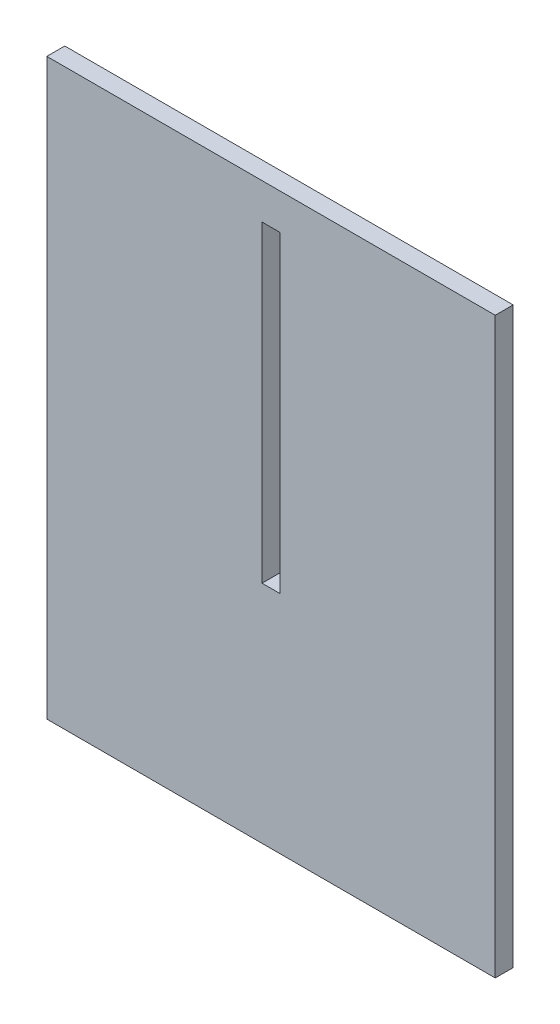
ISO-10303-21;
HEADER;
FILE_DESCRIPTION(('STEP AP214'),'2;1');
FILE_NAME('part.step','',(''),(''),'','','');
FILE_SCHEMA(('AUTOMOTIVE_DESIGN { 1 0 10303 214 1 1 1 1 }'));
ENDSEC;
DATA;
#1=APPLICATION_CONTEXT('core data for automotive mechanical design processes');
#2=APPLICATION_PROTOCOL_DEFINITION('international standard','automotive_design',2000,#1);
#3=PRODUCT_CONTEXT('',#1,'mechanical');
#4=PRODUCT('Part','Part','',(#3));
#5=PRODUCT_RELATED_PRODUCT_CATEGORY('part','',(#4));
#6=PRODUCT_DEFINITION_FORMATION('','',#4);
#7=PRODUCT_DEFINITION_CONTEXT('part definition',#1,'design');
#8=PRODUCT_DEFINITION('design','',#6,#7);
#9=PRODUCT_DEFINITION_SHAPE('','',#8);
#10=(LENGTH_UNIT() NAMED_UNIT(*) SI_UNIT(.MILLI.,.METRE.));
#11=(NAMED_UNIT(*) PLANE_ANGLE_UNIT() SI_UNIT($,.RADIAN.));
#12=(NAMED_UNIT(*) SI_UNIT($,.STERADIAN.) SOLID_ANGLE_UNIT());
#13=UNCERTAINTY_MEASURE_WITH_UNIT(LENGTH_MEASURE(1.E-05),#10,'distance_accuracy_value','');
#14=(GEOMETRIC_REPRESENTATION_CONTEXT(3) GLOBAL_UNCERTAINTY_ASSIGNED_CONTEXT((#13)) GLOBAL_UNIT_ASSIGNED_CONTEXT((#10,
#11,#12)) REPRESENTATION_CONTEXT('',''));
#15=CARTESIAN_POINT('',(0.,0.,0.));
#16=DIRECTION('',(0.,0.,1.));
#17=DIRECTION('',(1.,0.,0.));
#18=AXIS2_PLACEMENT_3D('',#15,#16,#17);
#19=CARTESIAN_POINT('',(0.,0.,5.));
#20=DIRECTION('',(0.,0.,1.));
#21=DIRECTION('',(1.,0.,0.));
#22=AXIS2_PLACEMENT_3D('',#19,#20,#21);
#23=PLANE('',#22);
#24=DIRECTION('',(0.,-1.,0.));
#25=VECTOR('',#24,1.);
#26=CARTESIAN_POINT('',(0.,0.,5.));
#27=LINE('',#26,#25);
#28=CARTESIAN_POINT('',(0.,0.,5.));
#29=VERTEX_POINT('',#28);
#30=CARTESIAN_POINT('',(0.,-160.,5.));
#31=VERTEX_POINT('',#30);
#32=EDGE_CURVE('E153',#29,#31,#27,.T.);
#33=ORIENTED_EDGE('',*,*,#32,.T.);
#34=DIRECTION('',(1.,0.,0.));
#35=VECTOR('',#34,1.);
#36=CARTESIAN_POINT('',(0.,-160.,5.));
#37=LINE('',#36,#35);
#38=CARTESIAN_POINT('',(125.,-160.,5.));
#39=VERTEX_POINT('',#38);
#40=EDGE_CURVE('E157',#31,#39,#37,.T.);
#41=ORIENTED_EDGE('',*,*,#40,.T.);
#42=DIRECTION('',(0.,1.,0.));
#43=VECTOR('',#42,1.);
#44=CARTESIAN_POINT('',(125.,0.,5.));
#45=LINE('',#44,#43);
#46=CARTESIAN_POINT('',(125.,0.,5.));
#47=VERTEX_POINT('',#46);
#48=EDGE_CURVE('E161',#39,#47,#45,.T.);
#49=ORIENTED_EDGE('',*,*,#48,.T.);
#50=DIRECTION('',(-1.,0.,0.));
#51=VECTOR('',#50,1.);
#52=CARTESIAN_POINT('',(0.,0.,5.));
#53=LINE('',#52,#51);
#54=EDGE_CURVE('E164',#47,#29,#53,.T.);
#55=ORIENTED_EDGE('',*,*,#54,.T.);
#56=EDGE_LOOP('',(#33,#41,#49,#55));
#57=FACE_BOUND('',#56,.T.);
#58=DIRECTION('',(1.,0.,0.));
#59=VECTOR('',#58,1.);
#60=CARTESIAN_POINT('',(60.,-97.1892253638949,5.));
#61=LINE('',#60,#59);
#62=CARTESIAN_POINT('',(60.,-97.1892253638949,5.));
#63=VERTEX_POINT('',#62);
#64=CARTESIAN_POINT('',(65.,-97.1892253638949,5.));
#65=VERTEX_POINT('',#64);
#66=EDGE_CURVE('E114',#63,#65,#61,.T.);
#67=ORIENTED_EDGE('',*,*,#66,.F.);
#68=DIRECTION('',(0.,-1.,0.));
#69=VECTOR('',#68,1.);
#70=CARTESIAN_POINT('',(60.,-10.,5.));
#71=LINE('',#70,#69);
#72=CARTESIAN_POINT('',(60.,-10.,5.));
#73=VERTEX_POINT('',#72);
#74=EDGE_CURVE('E105',#73,#63,#71,.T.);
#75=ORIENTED_EDGE('',*,*,#74,.F.);
#76=DIRECTION('',(-1.,0.,0.));
#77=VECTOR('',#76,1.);
#78=CARTESIAN_POINT('',(60.,-10.,5.));
#79=LINE('',#78,#77);
#80=CARTESIAN_POINT('',(65.,-10.,5.));
#81=VERTEX_POINT('',#80);
#82=EDGE_CURVE('E131',#81,#73,#79,.T.);
#83=ORIENTED_EDGE('',*,*,#82,.F.);
#84=DIRECTION('',(0.,1.,0.));
#85=VECTOR('',#84,1.);
#86=CARTESIAN_POINT('',(65.,-10.,5.));
#87=LINE('',#86,#85);
#88=EDGE_CURVE('E127',#65,#81,#87,.T.);
#89=ORIENTED_EDGE('',*,*,#88,.F.);
#90=EDGE_LOOP('',(#67,#75,#83,#89));
#91=FACE_BOUND('',#90,.T.);
#92=ADVANCED_FACE('F39',(#57,#91),#23,.T.);
#93=CARTESIAN_POINT('',(0.,0.,0.));
#94=DIRECTION('',(0.,0.,1.));
#95=DIRECTION('',(1.,0.,0.));
#96=AXIS2_PLACEMENT_3D('',#93,#94,#95);
#97=PLANE('',#96);
#98=DIRECTION('',(0.,-1.,0.));
#99=VECTOR('',#98,1.);
#100=CARTESIAN_POINT('',(0.,0.,0.));
#101=LINE('',#100,#99);
#102=CARTESIAN_POINT('',(0.,0.,0.));
#103=VERTEX_POINT('',#102);
#104=CARTESIAN_POINT('',(0.,-160.,0.));
#105=VERTEX_POINT('',#104);
#106=EDGE_CURVE('E123',#103,#105,#101,.T.);
#107=ORIENTED_EDGE('',*,*,#106,.F.);
#108=DIRECTION('',(-1.,0.,0.));
#109=VECTOR('',#108,1.);
#110=CARTESIAN_POINT('',(0.,0.,0.));
#111=LINE('',#110,#109);
#112=CARTESIAN_POINT('',(125.,0.,0.));
#113=VERTEX_POINT('',#112);
#114=EDGE_CURVE('E158',#113,#103,#111,.T.);
#115=ORIENTED_EDGE('',*,*,#114,.F.);
#116=DIRECTION('',(0.,1.,0.));
#117=VECTOR('',#116,1.);
#118=CARTESIAN_POINT('',(125.,0.,0.));
#119=LINE('',#118,#117);
#120=CARTESIAN_POINT('',(125.,-160.,0.));
#121=VERTEX_POINT('',#120);
#122=EDGE_CURVE('E174',#121,#113,#119,.T.);
#123=ORIENTED_EDGE('',*,*,#122,.F.);
#124=DIRECTION('',(1.,0.,0.));
#125=VECTOR('',#124,1.);
#126=CARTESIAN_POINT('',(0.,-160.,0.));
#127=LINE('',#126,#125);
#128=EDGE_CURVE('E171',#105,#121,#127,.T.);
#129=ORIENTED_EDGE('',*,*,#128,.F.);
#130=EDGE_LOOP('',(#107,#115,#123,#129));
#131=FACE_BOUND('',#130,.T.);
#132=DIRECTION('',(0.,-1.,0.));
#133=VECTOR('',#132,1.);
#134=CARTESIAN_POINT('',(60.,-10.,0.));
#135=LINE('',#134,#133);
#136=CARTESIAN_POINT('',(60.,-10.,0.));
#137=VERTEX_POINT('',#136);
#138=CARTESIAN_POINT('',(60.,-97.1892253638949,0.));
#139=VERTEX_POINT('',#138);
#140=EDGE_CURVE('E63',#137,#139,#135,.T.);
#141=ORIENTED_EDGE('',*,*,#140,.T.);
#142=DIRECTION('',(1.,0.,0.));
#143=VECTOR('',#142,1.);
#144=CARTESIAN_POINT('',(60.,-97.1892253638949,0.));
#145=LINE('',#144,#143);
#146=CARTESIAN_POINT('',(65.,-97.1892253638949,0.));
#147=VERTEX_POINT('',#146);
#148=EDGE_CURVE('E121',#139,#147,#145,.T.);
#149=ORIENTED_EDGE('',*,*,#148,.T.);
#150=DIRECTION('',(0.,1.,0.));
#151=VECTOR('',#150,1.);
#152=CARTESIAN_POINT('',(65.,-10.,0.));
#153=LINE('',#152,#151);
#154=CARTESIAN_POINT('',(65.,-10.,0.));
#155=VERTEX_POINT('',#154);
#156=EDGE_CURVE('E140',#147,#155,#153,.T.);
#157=ORIENTED_EDGE('',*,*,#156,.T.);
#158=DIRECTION('',(-1.,0.,0.));
#159=VECTOR('',#158,1.);
#160=CARTESIAN_POINT('',(60.,-10.,0.));
#161=LINE('',#160,#159);
#162=EDGE_CURVE('E115',#155,#137,#161,.T.);
#163=ORIENTED_EDGE('',*,*,#162,.T.);
#164=EDGE_LOOP('',(#141,#149,#157,#163));
#165=FACE_BOUND('',#164,.T.);
#166=ADVANCED_FACE('F197',(#131,#165),#97,.F.);
#167=CARTESIAN_POINT('',(0.,0.,5.));
#168=DIRECTION('',(1.,0.,0.));
#169=DIRECTION('',(0.,1.,0.));
#170=AXIS2_PLACEMENT_3D('',#167,#168,#169);
#171=PLANE('',#170);
#172=ORIENTED_EDGE('',*,*,#106,.T.);
#173=DIRECTION('',(0.,0.,-1.));
#174=VECTOR('',#173,1.);
#175=CARTESIAN_POINT('',(0.,-160.,5.));
#176=LINE('',#175,#174);
#177=EDGE_CURVE('E11',#31,#105,#176,.T.);
#178=ORIENTED_EDGE('',*,*,#177,.F.);
#179=ORIENTED_EDGE('',*,*,#32,.F.);
#180=DIRECTION('',(0.,0.,-1.));
#181=VECTOR('',#180,1.);
#182=CARTESIAN_POINT('',(0.,0.,5.));
#183=LINE('',#182,#181);
#184=EDGE_CURVE('E167',#29,#103,#183,.T.);
#185=ORIENTED_EDGE('',*,*,#184,.T.);
#186=EDGE_LOOP('',(#172,#178,#179,#185));
#187=FACE_BOUND('',#186,.T.);
#188=ADVANCED_FACE('F41',(#187),#171,.F.);
#189=CARTESIAN_POINT('',(0.,-160.,5.));
#190=DIRECTION('',(0.,1.,0.));
#191=DIRECTION('',(0.,0.,1.));
#192=AXIS2_PLACEMENT_3D('',#189,#190,#191);
#193=PLANE('',#192);
#194=ORIENTED_EDGE('',*,*,#128,.T.);
#195=DIRECTION('',(0.,0.,-1.));
#196=VECTOR('',#195,1.);
#197=CARTESIAN_POINT('',(125.,-160.,5.));
#198=LINE('',#197,#196);
#199=EDGE_CURVE('E48',#39,#121,#198,.T.);
#200=ORIENTED_EDGE('',*,*,#199,.F.);
#201=ORIENTED_EDGE('',*,*,#40,.F.);
#202=ORIENTED_EDGE('',*,*,#177,.T.);
#203=EDGE_LOOP('',(#194,#200,#201,#202));
#204=FACE_BOUND('',#203,.T.);
#205=ADVANCED_FACE('F207',(#204),#193,.F.);
#206=CARTESIAN_POINT('',(125.,0.,5.));
#207=DIRECTION('',(-1.,0.,0.));
#208=DIRECTION('',(0.,0.,1.));
#209=AXIS2_PLACEMENT_3D('',#206,#207,#208);
#210=PLANE('',#209);
#211=ORIENTED_EDGE('',*,*,#122,.T.);
#212=DIRECTION('',(0.,0.,-1.));
#213=VECTOR('',#212,1.);
#214=CARTESIAN_POINT('',(125.,0.,5.));
#215=LINE('',#214,#213);
#216=EDGE_CURVE('E182',#47,#113,#215,.T.);
#217=ORIENTED_EDGE('',*,*,#216,.F.);
#218=ORIENTED_EDGE('',*,*,#48,.F.);
#219=ORIENTED_EDGE('',*,*,#199,.T.);
#220=EDGE_LOOP('',(#211,#217,#218,#219));
#221=FACE_BOUND('',#220,.T.);
#222=ADVANCED_FACE('F191',(#221),#210,.F.);
#223=CARTESIAN_POINT('',(0.,0.,5.));
#224=DIRECTION('',(0.,-1.,0.));
#225=DIRECTION('',(0.,0.,-1.));
#226=AXIS2_PLACEMENT_3D('',#223,#224,#225);
#227=PLANE('',#226);
#228=ORIENTED_EDGE('',*,*,#114,.T.);
#229=ORIENTED_EDGE('',*,*,#184,.F.);
#230=ORIENTED_EDGE('',*,*,#54,.F.);
#231=ORIENTED_EDGE('',*,*,#216,.T.);
#232=EDGE_LOOP('',(#228,#229,#230,#231));
#233=FACE_BOUND('',#232,.T.);
#234=ADVANCED_FACE('F201',(#233),#227,.F.);
#235=CARTESIAN_POINT('',(60.,-10.,5.));
#236=DIRECTION('',(1.,0.,0.));
#237=DIRECTION('',(0.,1.,0.));
#238=AXIS2_PLACEMENT_3D('',#235,#236,#237);
#239=PLANE('',#238);
#240=ORIENTED_EDGE('',*,*,#140,.F.);
#241=DIRECTION('',(0.,0.,-1.));
#242=VECTOR('',#241,1.);
#243=CARTESIAN_POINT('',(60.,-10.,5.));
#244=LINE('',#243,#242);
#245=EDGE_CURVE('E109',#73,#137,#244,.T.);
#246=ORIENTED_EDGE('',*,*,#245,.F.);
#247=ORIENTED_EDGE('',*,*,#74,.T.);
#248=DIRECTION('',(0.,0.,-1.));
#249=VECTOR('',#248,1.);
#250=CARTESIAN_POINT('',(60.,-97.1892253638949,5.));
#251=LINE('',#250,#249);
#252=EDGE_CURVE('E108',#63,#139,#251,.T.);
#253=ORIENTED_EDGE('',*,*,#252,.T.);
#254=EDGE_LOOP('',(#240,#246,#247,#253));
#255=FACE_BOUND('',#254,.T.);
#256=ADVANCED_FACE('F107',(#255),#239,.T.);
#257=CARTESIAN_POINT('',(60.,-97.1892253638949,5.));
#258=DIRECTION('',(0.,1.,0.));
#259=DIRECTION('',(-1.,0.,0.));
#260=AXIS2_PLACEMENT_3D('',#257,#258,#259);
#261=PLANE('',#260);
#262=ORIENTED_EDGE('',*,*,#148,.F.);
#263=ORIENTED_EDGE('',*,*,#252,.F.);
#264=ORIENTED_EDGE('',*,*,#66,.T.);
#265=DIRECTION('',(0.,0.,-1.));
#266=VECTOR('',#265,1.);
#267=CARTESIAN_POINT('',(65.,-97.1892253638949,5.));
#268=LINE('',#267,#266);
#269=EDGE_CURVE('E124',#65,#147,#268,.T.);
#270=ORIENTED_EDGE('',*,*,#269,.T.);
#271=EDGE_LOOP('',(#262,#263,#264,#270));
#272=FACE_BOUND('',#271,.T.);
#273=ADVANCED_FACE('F118',(#272),#261,.T.);
#274=CARTESIAN_POINT('',(65.,-10.,5.));
#275=DIRECTION('',(-1.,0.,0.));
#276=DIRECTION('',(0.,-1.,0.));
#277=AXIS2_PLACEMENT_3D('',#274,#275,#276);
#278=PLANE('',#277);
#279=ORIENTED_EDGE('',*,*,#156,.F.);
#280=ORIENTED_EDGE('',*,*,#269,.F.);
#281=ORIENTED_EDGE('',*,*,#88,.T.);
#282=DIRECTION('',(0.,0.,-1.));
#283=VECTOR('',#282,1.);
#284=CARTESIAN_POINT('',(65.,-10.,5.));
#285=LINE('',#284,#283);
#286=EDGE_CURVE('E55',#81,#155,#285,.T.);
#287=ORIENTED_EDGE('',*,*,#286,.T.);
#288=EDGE_LOOP('',(#279,#280,#281,#287));
#289=FACE_BOUND('',#288,.T.);
#290=ADVANCED_FACE('F230',(#289),#278,.T.);
#291=CARTESIAN_POINT('',(60.,-10.,5.));
#292=DIRECTION('',(0.,-1.,0.));
#293=DIRECTION('',(0.,0.,-1.));
#294=AXIS2_PLACEMENT_3D('',#291,#292,#293);
#295=PLANE('',#294);
#296=ORIENTED_EDGE('',*,*,#162,.F.);
#297=ORIENTED_EDGE('',*,*,#286,.F.);
#298=ORIENTED_EDGE('',*,*,#82,.T.);
#299=ORIENTED_EDGE('',*,*,#245,.T.);
#300=EDGE_LOOP('',(#296,#297,#298,#299));
#301=FACE_BOUND('',#300,.T.);
#302=ADVANCED_FACE('F234',(#301),#295,.T.);
#303=CLOSED_SHELL('',(#92,#166,#188,#205,#222,#234,#256,#273,#290,#302));
#304=MANIFOLD_SOLID_BREP('B2',#303);
#305=ADVANCED_BREP_SHAPE_REPRESENTATION('',(#18,#304),#14);
#306=SHAPE_DEFINITION_REPRESENTATION(#9,#305);
ENDSEC;
END-ISO-10303-21;
